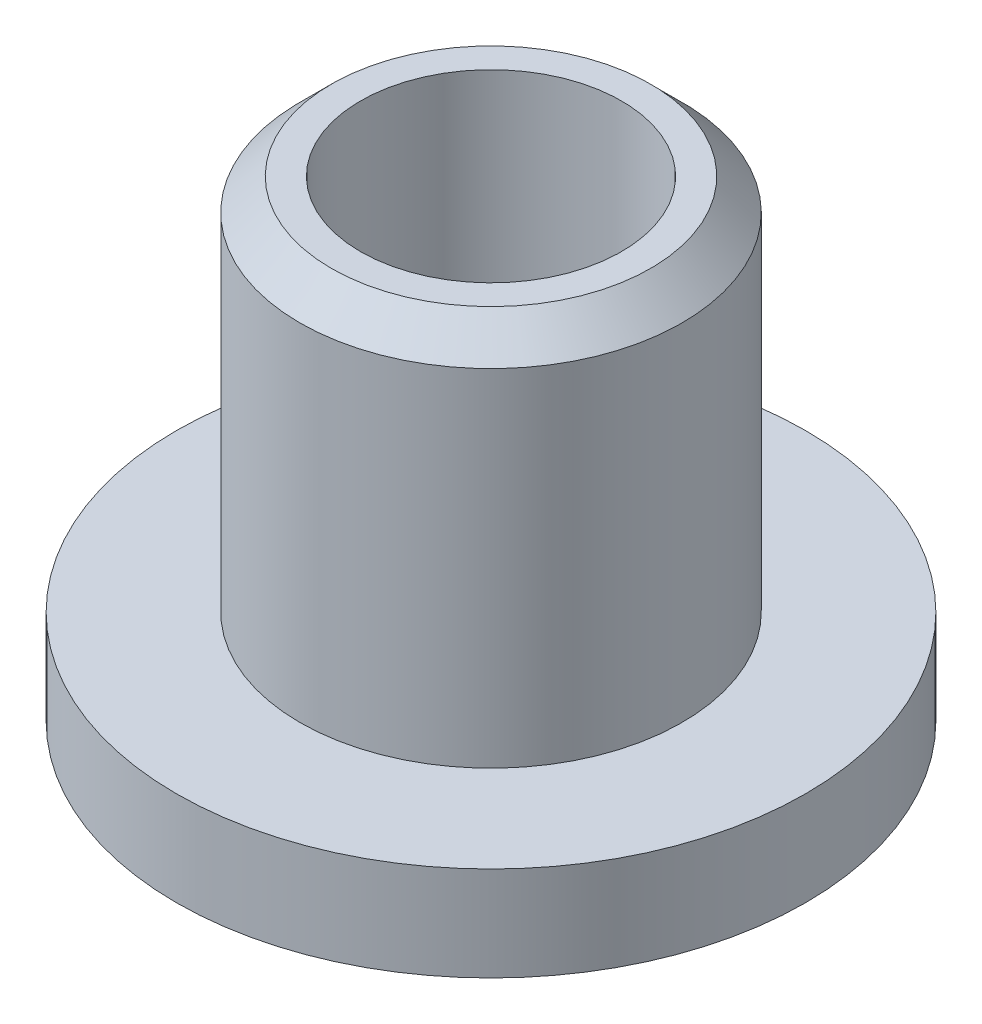
ISO-10303-21;
HEADER;
FILE_DESCRIPTION(('STEP AP214'),'2;1');
FILE_NAME('part.step','',(''),(''),'','','');
FILE_SCHEMA(('AUTOMOTIVE_DESIGN { 1 0 10303 214 1 1 1 1 }'));
ENDSEC;
DATA;
#1=APPLICATION_CONTEXT('core data for automotive mechanical design processes');
#2=APPLICATION_PROTOCOL_DEFINITION('international standard','automotive_design',2000,#1);
#3=PRODUCT_CONTEXT('',#1,'mechanical');
#4=PRODUCT('Part','Part','',(#3));
#5=PRODUCT_RELATED_PRODUCT_CATEGORY('part','',(#4));
#6=PRODUCT_DEFINITION_FORMATION('','',#4);
#7=PRODUCT_DEFINITION_CONTEXT('part definition',#1,'design');
#8=PRODUCT_DEFINITION('design','',#6,#7);
#9=PRODUCT_DEFINITION_SHAPE('','',#8);
#10=(LENGTH_UNIT() NAMED_UNIT(*) SI_UNIT(.MILLI.,.METRE.));
#11=(NAMED_UNIT(*) PLANE_ANGLE_UNIT() SI_UNIT($,.RADIAN.));
#12=(NAMED_UNIT(*) SI_UNIT($,.STERADIAN.) SOLID_ANGLE_UNIT());
#13=UNCERTAINTY_MEASURE_WITH_UNIT(LENGTH_MEASURE(1.E-05),#10,'distance_accuracy_value','');
#14=(GEOMETRIC_REPRESENTATION_CONTEXT(3) GLOBAL_UNCERTAINTY_ASSIGNED_CONTEXT((#13)) GLOBAL_UNIT_ASSIGNED_CONTEXT((#10,
#11,#12)) REPRESENTATION_CONTEXT('',''));
#15=CARTESIAN_POINT('',(0.,0.,0.));
#16=DIRECTION('',(0.,0.,1.));
#17=DIRECTION('',(1.,0.,0.));
#18=AXIS2_PLACEMENT_3D('',#15,#16,#17);
#19=CARTESIAN_POINT('',(0.,3.,0.));
#20=DIRECTION('',(0.,-1.,0.));
#21=DIRECTION('',(0.,0.,-1.));
#22=AXIS2_PLACEMENT_3D('',#19,#20,#21);
#23=CYLINDRICAL_SURFACE('',#22,10.);
#24=CARTESIAN_POINT('',(0.,3.,0.));
#25=DIRECTION('',(0.,1.,0.));
#26=DIRECTION('',(0.,0.,1.));
#27=AXIS2_PLACEMENT_3D('',#24,#25,#26);
#28=CIRCLE('',#27,10.);
#29=CARTESIAN_POINT('',(0.,3.,10.));
#30=VERTEX_POINT('',#29);
#31=EDGE_CURVE('E63',#30,#30,#28,.T.);
#32=ORIENTED_EDGE('',*,*,#31,.F.);
#33=EDGE_LOOP('',(#32));
#34=FACE_BOUND('',#33,.T.);
#35=CARTESIAN_POINT('',(0.,0.,0.));
#36=DIRECTION('',(0.,1.,0.));
#37=DIRECTION('',(0.,0.,1.));
#38=AXIS2_PLACEMENT_3D('',#35,#36,#37);
#39=CIRCLE('',#38,10.);
#40=CARTESIAN_POINT('',(0.,0.,10.));
#41=VERTEX_POINT('',#40);
#42=EDGE_CURVE('E60',#41,#41,#39,.T.);
#43=ORIENTED_EDGE('',*,*,#42,.T.);
#44=EDGE_LOOP('',(#43));
#45=FACE_BOUND('',#44,.T.);
#46=ADVANCED_FACE('F39',(#34,#45),#23,.T.);
#47=CARTESIAN_POINT('',(0.,3.,0.));
#48=DIRECTION('',(0.,1.,0.));
#49=DIRECTION('',(0.,0.,1.));
#50=AXIS2_PLACEMENT_3D('',#47,#48,#49);
#51=PLANE('',#50);
#52=CARTESIAN_POINT('',(0.,3.,0.));
#53=DIRECTION('',(0.,1.,0.));
#54=DIRECTION('',(0.,0.,1.));
#55=AXIS2_PLACEMENT_3D('',#52,#53,#54);
#56=CIRCLE('',#55,6.075);
#57=CARTESIAN_POINT('',(0.,3.,6.075));
#58=VERTEX_POINT('',#57);
#59=EDGE_CURVE('E59',#58,#58,#56,.T.);
#60=ORIENTED_EDGE('',*,*,#59,.F.);
#61=EDGE_LOOP('',(#60));
#62=FACE_BOUND('',#61,.T.);
#63=ORIENTED_EDGE('',*,*,#31,.T.);
#64=EDGE_LOOP('',(#63));
#65=FACE_BOUND('',#64,.T.);
#66=ADVANCED_FACE('F88',(#62,#65),#51,.T.);
#67=CARTESIAN_POINT('',(0.,0.,0.));
#68=DIRECTION('',(0.,1.,0.));
#69=DIRECTION('',(0.,0.,1.));
#70=AXIS2_PLACEMENT_3D('',#67,#68,#69);
#71=PLANE('',#70);
#72=CARTESIAN_POINT('',(0.,0.,0.));
#73=DIRECTION('',(0.,1.,0.));
#74=DIRECTION('',(0.,0.,1.));
#75=AXIS2_PLACEMENT_3D('',#72,#73,#74);
#76=CIRCLE('',#75,5.15000000000001);
#77=CARTESIAN_POINT('',(0.,0.,5.15000000000001));
#78=VERTEX_POINT('',#77);
#79=EDGE_CURVE('E54',#78,#78,#76,.T.);
#80=ORIENTED_EDGE('',*,*,#79,.T.);
#81=EDGE_LOOP('',(#80));
#82=FACE_BOUND('',#81,.T.);
#83=ORIENTED_EDGE('',*,*,#42,.F.);
#84=EDGE_LOOP('',(#83));
#85=FACE_BOUND('',#84,.T.);
#86=ADVANCED_FACE('F85',(#82,#85),#71,.F.);
#87=CARTESIAN_POINT('',(0.,15.,0.));
#88=DIRECTION('',(0.,-1.,0.));
#89=DIRECTION('',(0.,0.,-1.));
#90=AXIS2_PLACEMENT_3D('',#87,#88,#89);
#91=CYLINDRICAL_SURFACE('',#90,6.075);
#92=CARTESIAN_POINT('',(0.,14.,0.));
#93=DIRECTION('',(0.,1.,0.));
#94=DIRECTION('',(0.,0.,1.));
#95=AXIS2_PLACEMENT_3D('',#92,#93,#94);
#96=CIRCLE('',#95,6.075);
#97=CARTESIAN_POINT('',(0.,14.,6.075));
#98=VERTEX_POINT('',#97);
#99=EDGE_CURVE('E10',#98,#98,#96,.F.);
#100=ORIENTED_EDGE('',*,*,#99,.T.);
#101=EDGE_LOOP('',(#100));
#102=FACE_BOUND('',#101,.T.);
#103=ORIENTED_EDGE('',*,*,#59,.T.);
#104=EDGE_LOOP('',(#103));
#105=FACE_BOUND('',#104,.T.);
#106=ADVANCED_FACE('F76',(#102,#105),#91,.T.);
#107=CARTESIAN_POINT('',(0.,15.,0.));
#108=DIRECTION('',(0.,1.,0.));
#109=DIRECTION('',(0.,0.,1.));
#110=AXIS2_PLACEMENT_3D('',#107,#108,#109);
#111=PLANE('',#110);
#112=CARTESIAN_POINT('',(0.,15.,0.));
#113=DIRECTION('',(0.,1.,0.));
#114=DIRECTION('',(0.,0.,1.));
#115=AXIS2_PLACEMENT_3D('',#112,#113,#114);
#116=CIRCLE('',#115,5.07499999999999);
#117=CARTESIAN_POINT('',(0.,15.,5.07499999999999));
#118=VERTEX_POINT('',#117);
#119=EDGE_CURVE('E46',#118,#118,#116,.T.);
#120=ORIENTED_EDGE('',*,*,#119,.T.);
#121=EDGE_LOOP('',(#120));
#122=FACE_BOUND('',#121,.T.);
#123=CARTESIAN_POINT('',(0.,15.,0.));
#124=DIRECTION('',(0.,1.,0.));
#125=DIRECTION('',(0.,0.,1.));
#126=AXIS2_PLACEMENT_3D('',#123,#124,#125);
#127=CIRCLE('',#126,4.15);
#128=CARTESIAN_POINT('',(0.,15.,4.15));
#129=VERTEX_POINT('',#128);
#130=EDGE_CURVE('E64',#129,#129,#127,.T.);
#131=ORIENTED_EDGE('',*,*,#130,.F.);
#132=EDGE_LOOP('',(#131));
#133=FACE_BOUND('',#132,.T.);
#134=ADVANCED_FACE('F74',(#122,#133),#111,.T.);
#135=CARTESIAN_POINT('',(0.,0.,0.));
#136=DIRECTION('',(0.,1.,0.));
#137=DIRECTION('',(0.,0.,1.));
#138=AXIS2_PLACEMENT_3D('',#135,#136,#137);
#139=CYLINDRICAL_SURFACE('',#138,4.15);
#140=CARTESIAN_POINT('',(0.,1.00000000000001,0.));
#141=DIRECTION('',(0.,1.,0.));
#142=DIRECTION('',(0.,0.,1.));
#143=AXIS2_PLACEMENT_3D('',#140,#141,#142);
#144=CIRCLE('',#143,4.15);
#145=CARTESIAN_POINT('',(0.,1.00000000000001,4.15));
#146=VERTEX_POINT('',#145);
#147=EDGE_CURVE('E50',#146,#146,#144,.F.);
#148=ORIENTED_EDGE('',*,*,#147,.T.);
#149=EDGE_LOOP('',(#148));
#150=FACE_BOUND('',#149,.T.);
#151=ORIENTED_EDGE('',*,*,#130,.T.);
#152=EDGE_LOOP('',(#151));
#153=FACE_BOUND('',#152,.T.);
#154=ADVANCED_FACE('F72',(#150,#153),#139,.F.);
#155=CARTESIAN_POINT('',(0.,0.,0.));
#156=DIRECTION('',(0.,-1.,0.));
#157=DIRECTION('',(0.,0.,-1.));
#158=AXIS2_PLACEMENT_3D('',#155,#156,#157);
#159=CONICAL_SURFACE('',#158,5.15000000000001,0.785398163397447);
#160=ORIENTED_EDGE('',*,*,#147,.F.);
#161=EDGE_LOOP('',(#160));
#162=FACE_BOUND('',#161,.T.);
#163=ORIENTED_EDGE('',*,*,#79,.F.);
#164=EDGE_LOOP('',(#163));
#165=FACE_BOUND('',#164,.T.);
#166=ADVANCED_FACE('F82',(#162,#165),#159,.F.);
#167=CARTESIAN_POINT('',(0.,15.,0.));
#168=DIRECTION('',(0.,-1.,0.));
#169=DIRECTION('',(0.,0.,-1.));
#170=AXIS2_PLACEMENT_3D('',#167,#168,#169);
#171=CONICAL_SURFACE('',#170,5.07499999999999,0.785398163397448);
#172=ORIENTED_EDGE('',*,*,#99,.F.);
#173=EDGE_LOOP('',(#172));
#174=FACE_BOUND('',#173,.T.);
#175=ORIENTED_EDGE('',*,*,#119,.F.);
#176=EDGE_LOOP('',(#175));
#177=FACE_BOUND('',#176,.T.);
#178=ADVANCED_FACE('F41',(#174,#177),#171,.T.);
#179=CLOSED_SHELL('',(#46,#66,#86,#106,#134,#154,#166,#178));
#180=MANIFOLD_SOLID_BREP('B2',#179);
#181=ADVANCED_BREP_SHAPE_REPRESENTATION('',(#18,#180),#14);
#182=SHAPE_DEFINITION_REPRESENTATION(#9,#181);
ENDSEC;
END-ISO-10303-21;
